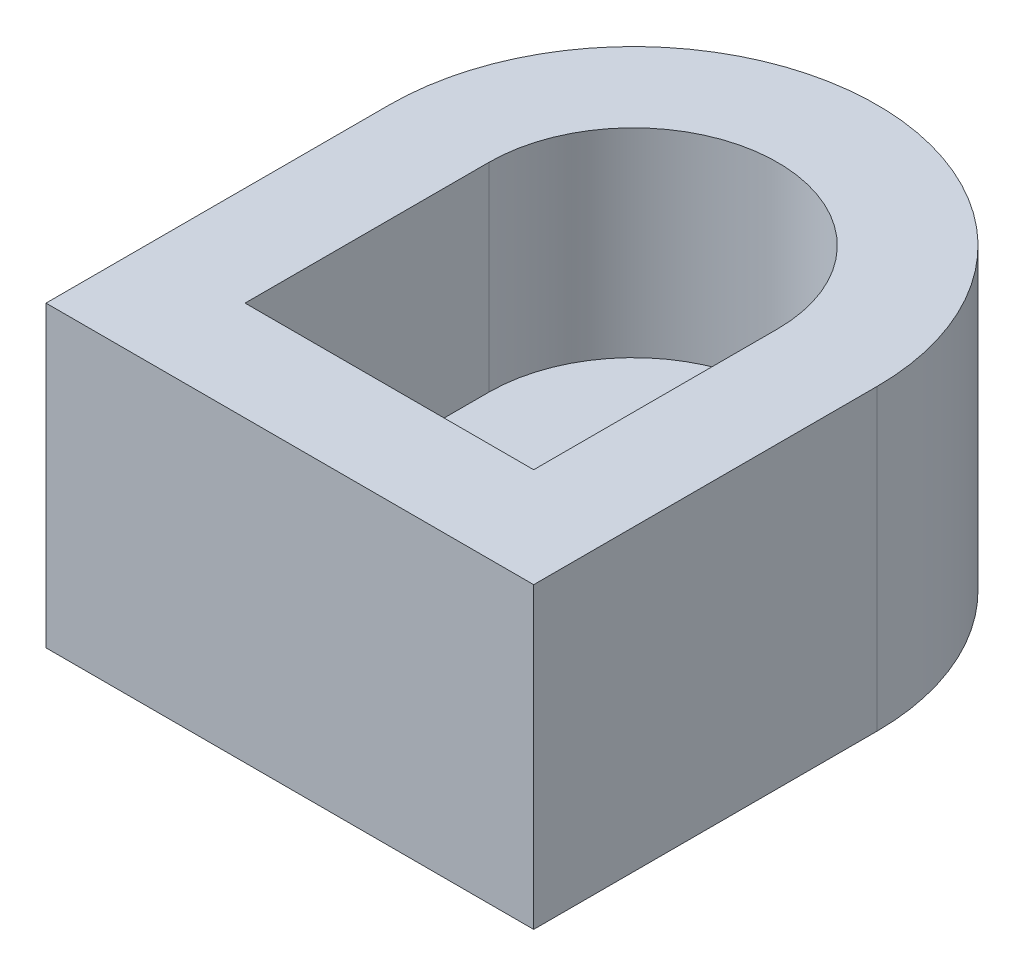
ISO-10303-21;
HEADER;
FILE_DESCRIPTION(('STEP AP214'),'2;1');
FILE_NAME('part.step','',(''),(''),'','','');
FILE_SCHEMA(('AUTOMOTIVE_DESIGN { 1 0 10303 214 1 1 1 1 }'));
ENDSEC;
DATA;
#1=APPLICATION_CONTEXT('core data for automotive mechanical design processes');
#2=APPLICATION_PROTOCOL_DEFINITION('international standard','automotive_design',2000,#1);
#3=PRODUCT_CONTEXT('',#1,'mechanical');
#4=PRODUCT('Part','Part','',(#3));
#5=PRODUCT_RELATED_PRODUCT_CATEGORY('part','',(#4));
#6=PRODUCT_DEFINITION_FORMATION('','',#4);
#7=PRODUCT_DEFINITION_CONTEXT('part definition',#1,'design');
#8=PRODUCT_DEFINITION('design','',#6,#7);
#9=PRODUCT_DEFINITION_SHAPE('','',#8);
#10=(LENGTH_UNIT() NAMED_UNIT(*) SI_UNIT(.MILLI.,.METRE.));
#11=(NAMED_UNIT(*) PLANE_ANGLE_UNIT() SI_UNIT($,.RADIAN.));
#12=(NAMED_UNIT(*) SI_UNIT($,.STERADIAN.) SOLID_ANGLE_UNIT());
#13=UNCERTAINTY_MEASURE_WITH_UNIT(LENGTH_MEASURE(1.E-05),#10,'distance_accuracy_value','');
#14=(GEOMETRIC_REPRESENTATION_CONTEXT(3) GLOBAL_UNCERTAINTY_ASSIGNED_CONTEXT((#13)) GLOBAL_UNIT_ASSIGNED_CONTEXT((#10,
#11,#12)) REPRESENTATION_CONTEXT('',''));
#15=CARTESIAN_POINT('',(0.,0.,0.));
#16=DIRECTION('',(0.,0.,1.));
#17=DIRECTION('',(1.,0.,0.));
#18=AXIS2_PLACEMENT_3D('',#15,#16,#17);
#19=CARTESIAN_POINT('',(0.,4.,0.));
#20=DIRECTION('',(0.,-1.,0.));
#21=DIRECTION('',(0.,0.,-1.));
#22=AXIS2_PLACEMENT_3D('',#19,#20,#21);
#23=CYLINDRICAL_SURFACE('',#22,2.9);
#24=CARTESIAN_POINT('',(0.,0.,0.));
#25=DIRECTION('',(0.,1.,0.));
#26=DIRECTION('',(0.,0.,1.));
#27=AXIS2_PLACEMENT_3D('',#24,#25,#26);
#28=CIRCLE('',#27,2.9);
#29=CARTESIAN_POINT('',(2.9,0.,0.));
#30=VERTEX_POINT('',#29);
#31=CARTESIAN_POINT('',(-2.9,0.,0.));
#32=VERTEX_POINT('',#31);
#33=EDGE_CURVE('E142',#30,#32,#28,.T.);
#34=ORIENTED_EDGE('',*,*,#33,.F.);
#35=DIRECTION('',(0.,-1.,0.));
#36=VECTOR('',#35,1.);
#37=CARTESIAN_POINT('',(2.9,4.,0.));
#38=LINE('',#37,#36);
#39=CARTESIAN_POINT('',(2.9,4.,0.));
#40=VERTEX_POINT('',#39);
#41=EDGE_CURVE('E11',#40,#30,#38,.T.);
#42=ORIENTED_EDGE('',*,*,#41,.F.);
#43=CARTESIAN_POINT('',(0.,4.,0.));
#44=DIRECTION('',(0.,1.,0.));
#45=DIRECTION('',(0.,0.,1.));
#46=AXIS2_PLACEMENT_3D('',#43,#44,#45);
#47=CIRCLE('',#46,2.9);
#48=CARTESIAN_POINT('',(-2.9,4.,0.));
#49=VERTEX_POINT('',#48);
#50=EDGE_CURVE('E155',#40,#49,#47,.T.);
#51=ORIENTED_EDGE('',*,*,#50,.T.);
#52=DIRECTION('',(0.,-1.,0.));
#53=VECTOR('',#52,1.);
#54=CARTESIAN_POINT('',(-2.9,4.,0.));
#55=LINE('',#54,#53);
#56=EDGE_CURVE('E64',#49,#32,#55,.T.);
#57=ORIENTED_EDGE('',*,*,#56,.T.);
#58=EDGE_LOOP('',(#34,#42,#51,#57));
#59=FACE_BOUND('',#58,.T.);
#60=ADVANCED_FACE('F45',(#59),#23,.F.);
#61=CARTESIAN_POINT('',(2.9,4.,0.));
#62=DIRECTION('',(1.,0.,0.));
#63=DIRECTION('',(0.,0.,-1.));
#64=AXIS2_PLACEMENT_3D('',#61,#62,#63);
#65=PLANE('',#64);
#66=DIRECTION('',(0.,0.,1.));
#67=VECTOR('',#66,1.);
#68=CARTESIAN_POINT('',(2.9,0.,0.));
#69=LINE('',#68,#67);
#70=CARTESIAN_POINT('',(2.9,0.,4.9));
#71=VERTEX_POINT('',#70);
#72=EDGE_CURVE('E170',#30,#71,#69,.T.);
#73=ORIENTED_EDGE('',*,*,#72,.T.);
#74=DIRECTION('',(0.,-1.,0.));
#75=VECTOR('',#74,1.);
#76=CARTESIAN_POINT('',(2.9,4.,4.9));
#77=LINE('',#76,#75);
#78=CARTESIAN_POINT('',(2.9,4.,4.9));
#79=VERTEX_POINT('',#78);
#80=EDGE_CURVE('E56',#79,#71,#77,.T.);
#81=ORIENTED_EDGE('',*,*,#80,.F.);
#82=DIRECTION('',(0.,0.,1.));
#83=VECTOR('',#82,1.);
#84=CARTESIAN_POINT('',(2.9,4.,0.));
#85=LINE('',#84,#83);
#86=EDGE_CURVE('E158',#40,#79,#85,.T.);
#87=ORIENTED_EDGE('',*,*,#86,.F.);
#88=ORIENTED_EDGE('',*,*,#41,.T.);
#89=EDGE_LOOP('',(#73,#81,#87,#88));
#90=FACE_BOUND('',#89,.T.);
#91=ADVANCED_FACE('F215',(#90),#65,.F.);
#92=CARTESIAN_POINT('',(0.,4.,4.9));
#93=DIRECTION('',(0.,0.,-1.));
#94=DIRECTION('',(-1.,0.,0.));
#95=AXIS2_PLACEMENT_3D('',#92,#93,#94);
#96=PLANE('',#95);
#97=DIRECTION('',(1.,0.,0.));
#98=VECTOR('',#97,1.);
#99=CARTESIAN_POINT('',(0.,0.,4.9));
#100=LINE('',#99,#98);
#101=CARTESIAN_POINT('',(-2.9,0.,4.9));
#102=VERTEX_POINT('',#101);
#103=EDGE_CURVE('E174',#102,#71,#100,.T.);
#104=ORIENTED_EDGE('',*,*,#103,.F.);
#105=DIRECTION('',(0.,-1.,0.));
#106=VECTOR('',#105,1.);
#107=CARTESIAN_POINT('',(-2.9,4.,4.9));
#108=LINE('',#107,#106);
#109=CARTESIAN_POINT('',(-2.9,4.,4.9));
#110=VERTEX_POINT('',#109);
#111=EDGE_CURVE('E182',#110,#102,#108,.T.);
#112=ORIENTED_EDGE('',*,*,#111,.F.);
#113=DIRECTION('',(1.,0.,0.));
#114=VECTOR('',#113,1.);
#115=CARTESIAN_POINT('',(0.,4.,4.9));
#116=LINE('',#115,#114);
#117=EDGE_CURVE('E161',#110,#79,#116,.T.);
#118=ORIENTED_EDGE('',*,*,#117,.T.);
#119=ORIENTED_EDGE('',*,*,#80,.T.);
#120=EDGE_LOOP('',(#104,#112,#118,#119));
#121=FACE_BOUND('',#120,.T.);
#122=ADVANCED_FACE('F221',(#121),#96,.T.);
#123=CARTESIAN_POINT('',(4.9,4.,0.));
#124=DIRECTION('',(1.,0.,0.));
#125=DIRECTION('',(0.,0.,-1.));
#126=AXIS2_PLACEMENT_3D('',#123,#124,#125);
#127=PLANE('',#126);
#128=DIRECTION('',(0.,-1.,0.));
#129=VECTOR('',#128,1.);
#130=CARTESIAN_POINT('',(4.9,4.,6.9));
#131=LINE('',#130,#129);
#132=CARTESIAN_POINT('',(4.9,4.,6.9));
#133=VERTEX_POINT('',#132);
#134=CARTESIAN_POINT('',(4.9,-2.,6.9));
#135=VERTEX_POINT('',#134);
#136=EDGE_CURVE('E124',#133,#135,#131,.T.);
#137=ORIENTED_EDGE('',*,*,#136,.T.);
#138=DIRECTION('',(0.,0.,1.));
#139=VECTOR('',#138,1.);
#140=CARTESIAN_POINT('',(4.9,-2.,0.));
#141=LINE('',#140,#139);
#142=CARTESIAN_POINT('',(4.9,-2.,0.));
#143=VERTEX_POINT('',#142);
#144=EDGE_CURVE('E122',#143,#135,#141,.T.);
#145=ORIENTED_EDGE('',*,*,#144,.F.);
#146=DIRECTION('',(0.,-1.,0.));
#147=VECTOR('',#146,1.);
#148=CARTESIAN_POINT('',(4.9,4.,0.));
#149=LINE('',#148,#147);
#150=CARTESIAN_POINT('',(4.9,4.,0.));
#151=VERTEX_POINT('',#150);
#152=EDGE_CURVE('E49',#151,#143,#149,.T.);
#153=ORIENTED_EDGE('',*,*,#152,.F.);
#154=DIRECTION('',(0.,0.,1.));
#155=VECTOR('',#154,1.);
#156=CARTESIAN_POINT('',(4.9,4.,0.));
#157=LINE('',#156,#155);
#158=EDGE_CURVE('E143',#151,#133,#157,.T.);
#159=ORIENTED_EDGE('',*,*,#158,.T.);
#160=EDGE_LOOP('',(#137,#145,#153,#159));
#161=FACE_BOUND('',#160,.T.);
#162=ADVANCED_FACE('F47',(#161),#127,.T.);
#163=CARTESIAN_POINT('',(0.,4.,0.));
#164=DIRECTION('',(0.,-1.,0.));
#165=DIRECTION('',(0.,0.,-1.));
#166=AXIS2_PLACEMENT_3D('',#163,#164,#165);
#167=CYLINDRICAL_SURFACE('',#166,4.9);
#168=ORIENTED_EDGE('',*,*,#152,.T.);
#169=CARTESIAN_POINT('',(0.,-2.,0.));
#170=DIRECTION('',(0.,1.,0.));
#171=DIRECTION('',(0.,0.,1.));
#172=AXIS2_PLACEMENT_3D('',#169,#170,#171);
#173=CIRCLE('',#172,4.9);
#174=CARTESIAN_POINT('',(-4.9,-2.,0.));
#175=VERTEX_POINT('',#174);
#176=EDGE_CURVE('E114',#143,#175,#173,.T.);
#177=ORIENTED_EDGE('',*,*,#176,.T.);
#178=DIRECTION('',(0.,-1.,0.));
#179=VECTOR('',#178,1.);
#180=CARTESIAN_POINT('',(-4.9,4.,0.));
#181=LINE('',#180,#179);
#182=CARTESIAN_POINT('',(-4.9,4.,0.));
#183=VERTEX_POINT('',#182);
#184=EDGE_CURVE('E120',#183,#175,#181,.T.);
#185=ORIENTED_EDGE('',*,*,#184,.F.);
#186=CARTESIAN_POINT('',(0.,4.,0.));
#187=DIRECTION('',(0.,1.,0.));
#188=DIRECTION('',(0.,0.,1.));
#189=AXIS2_PLACEMENT_3D('',#186,#187,#188);
#190=CIRCLE('',#189,4.9);
#191=EDGE_CURVE('E115',#151,#183,#190,.T.);
#192=ORIENTED_EDGE('',*,*,#191,.F.);
#193=EDGE_LOOP('',(#168,#177,#185,#192));
#194=FACE_BOUND('',#193,.T.);
#195=ADVANCED_FACE('F111',(#194),#167,.T.);
#196=CARTESIAN_POINT('',(-4.9,4.,0.));
#197=DIRECTION('',(1.,0.,0.));
#198=DIRECTION('',(0.,0.,-1.));
#199=AXIS2_PLACEMENT_3D('',#196,#197,#198);
#200=PLANE('',#199);
#201=ORIENTED_EDGE('',*,*,#184,.T.);
#202=DIRECTION('',(0.,0.,1.));
#203=VECTOR('',#202,1.);
#204=CARTESIAN_POINT('',(-4.9,-2.,0.));
#205=LINE('',#204,#203);
#206=CARTESIAN_POINT('',(-4.9,-2.,6.9));
#207=VERTEX_POINT('',#206);
#208=EDGE_CURVE('E133',#175,#207,#205,.T.);
#209=ORIENTED_EDGE('',*,*,#208,.T.);
#210=DIRECTION('',(0.,-1.,0.));
#211=VECTOR('',#210,1.);
#212=CARTESIAN_POINT('',(-4.9,4.,6.9));
#213=LINE('',#212,#211);
#214=CARTESIAN_POINT('',(-4.9,4.,6.9));
#215=VERTEX_POINT('',#214);
#216=EDGE_CURVE('E191',#215,#207,#213,.T.);
#217=ORIENTED_EDGE('',*,*,#216,.F.);
#218=DIRECTION('',(0.,0.,1.));
#219=VECTOR('',#218,1.);
#220=CARTESIAN_POINT('',(-4.9,4.,0.));
#221=LINE('',#220,#219);
#222=EDGE_CURVE('E149',#183,#215,#221,.T.);
#223=ORIENTED_EDGE('',*,*,#222,.F.);
#224=EDGE_LOOP('',(#201,#209,#217,#223));
#225=FACE_BOUND('',#224,.T.);
#226=ADVANCED_FACE('F196',(#225),#200,.F.);
#227=CARTESIAN_POINT('',(0.,4.,6.9));
#228=DIRECTION('',(0.,0.,-1.));
#229=DIRECTION('',(-1.,0.,0.));
#230=AXIS2_PLACEMENT_3D('',#227,#228,#229);
#231=PLANE('',#230);
#232=ORIENTED_EDGE('',*,*,#216,.T.);
#233=DIRECTION('',(1.,0.,0.));
#234=VECTOR('',#233,1.);
#235=CARTESIAN_POINT('',(0.,-2.,6.9));
#236=LINE('',#235,#234);
#237=EDGE_CURVE('E137',#207,#135,#236,.T.);
#238=ORIENTED_EDGE('',*,*,#237,.T.);
#239=ORIENTED_EDGE('',*,*,#136,.F.);
#240=DIRECTION('',(1.,0.,0.));
#241=VECTOR('',#240,1.);
#242=CARTESIAN_POINT('',(0.,4.,6.9));
#243=LINE('',#242,#241);
#244=EDGE_CURVE('E152',#215,#133,#243,.T.);
#245=ORIENTED_EDGE('',*,*,#244,.F.);
#246=EDGE_LOOP('',(#232,#238,#239,#245));
#247=FACE_BOUND('',#246,.T.);
#248=ADVANCED_FACE('F203',(#247),#231,.F.);
#249=CARTESIAN_POINT('',(-2.9,4.,0.));
#250=DIRECTION('',(1.,0.,0.));
#251=DIRECTION('',(0.,0.,-1.));
#252=AXIS2_PLACEMENT_3D('',#249,#250,#251);
#253=PLANE('',#252);
#254=DIRECTION('',(0.,0.,1.));
#255=VECTOR('',#254,1.);
#256=CARTESIAN_POINT('',(-2.9,0.,0.));
#257=LINE('',#256,#255);
#258=EDGE_CURVE('E146',#32,#102,#257,.T.);
#259=ORIENTED_EDGE('',*,*,#258,.F.);
#260=ORIENTED_EDGE('',*,*,#56,.F.);
#261=DIRECTION('',(0.,0.,1.));
#262=VECTOR('',#261,1.);
#263=CARTESIAN_POINT('',(-2.9,4.,0.));
#264=LINE('',#263,#262);
#265=EDGE_CURVE('E165',#49,#110,#264,.T.);
#266=ORIENTED_EDGE('',*,*,#265,.T.);
#267=ORIENTED_EDGE('',*,*,#111,.T.);
#268=EDGE_LOOP('',(#259,#260,#266,#267));
#269=FACE_BOUND('',#268,.T.);
#270=ADVANCED_FACE('F205',(#269),#253,.T.);
#271=CARTESIAN_POINT('',(0.,4.,0.));
#272=DIRECTION('',(0.,1.,0.));
#273=DIRECTION('',(0.,0.,1.));
#274=AXIS2_PLACEMENT_3D('',#271,#272,#273);
#275=PLANE('',#274);
#276=ORIENTED_EDGE('',*,*,#158,.F.);
#277=ORIENTED_EDGE('',*,*,#191,.T.);
#278=ORIENTED_EDGE('',*,*,#222,.T.);
#279=ORIENTED_EDGE('',*,*,#244,.T.);
#280=EDGE_LOOP('',(#276,#277,#278,#279));
#281=FACE_BOUND('',#280,.T.);
#282=ORIENTED_EDGE('',*,*,#50,.F.);
#283=ORIENTED_EDGE('',*,*,#86,.T.);
#284=ORIENTED_EDGE('',*,*,#117,.F.);
#285=ORIENTED_EDGE('',*,*,#265,.F.);
#286=EDGE_LOOP('',(#282,#283,#284,#285));
#287=FACE_BOUND('',#286,.T.);
#288=ADVANCED_FACE('F200',(#281,#287),#275,.T.);
#289=CARTESIAN_POINT('',(0.,0.,0.));
#290=DIRECTION('',(0.,1.,0.));
#291=DIRECTION('',(0.,0.,1.));
#292=AXIS2_PLACEMENT_3D('',#289,#290,#291);
#293=PLANE('',#292);
#294=ORIENTED_EDGE('',*,*,#72,.F.);
#295=ORIENTED_EDGE('',*,*,#33,.T.);
#296=ORIENTED_EDGE('',*,*,#258,.T.);
#297=ORIENTED_EDGE('',*,*,#103,.T.);
#298=EDGE_LOOP('',(#294,#295,#296,#297));
#299=FACE_BOUND('',#298,.T.);
#300=ADVANCED_FACE('F230',(#299),#293,.T.);
#301=CARTESIAN_POINT('',(0.,-2.,0.));
#302=DIRECTION('',(0.,1.,0.));
#303=DIRECTION('',(0.,0.,1.));
#304=AXIS2_PLACEMENT_3D('',#301,#302,#303);
#305=PLANE('',#304);
#306=ORIENTED_EDGE('',*,*,#144,.T.);
#307=ORIENTED_EDGE('',*,*,#237,.F.);
#308=ORIENTED_EDGE('',*,*,#208,.F.);
#309=ORIENTED_EDGE('',*,*,#176,.F.);
#310=EDGE_LOOP('',(#306,#307,#308,#309));
#311=FACE_BOUND('',#310,.T.);
#312=ADVANCED_FACE('F131',(#311),#305,.F.);
#313=CLOSED_SHELL('',(#60,#91,#122,#162,#195,#226,#248,#270,#288,#300,#312));
#314=MANIFOLD_SOLID_BREP('B2',#313);
#315=ADVANCED_BREP_SHAPE_REPRESENTATION('',(#18,#314),#14);
#316=SHAPE_DEFINITION_REPRESENTATION(#9,#315);
ENDSEC;
END-ISO-10303-21;
